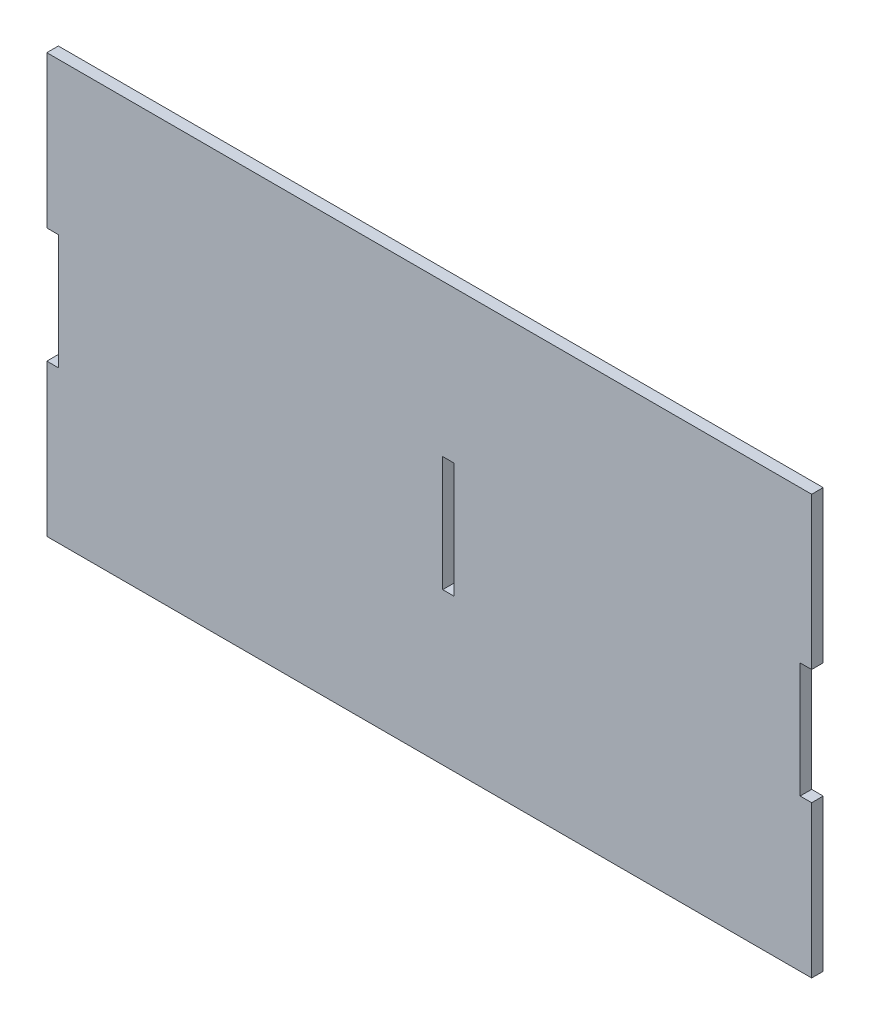
ISO-10303-21;
HEADER;
FILE_DESCRIPTION(('STEP AP214'),'2;1');
FILE_NAME('part.step','',(''),(''),'','','');
FILE_SCHEMA(('AUTOMOTIVE_DESIGN { 1 0 10303 214 1 1 1 1 }'));
ENDSEC;
DATA;
#1=APPLICATION_CONTEXT('core data for automotive mechanical design processes');
#2=APPLICATION_PROTOCOL_DEFINITION('international standard','automotive_design',2000,#1);
#3=PRODUCT_CONTEXT('',#1,'mechanical');
#4=PRODUCT('Part','Part','',(#3));
#5=PRODUCT_RELATED_PRODUCT_CATEGORY('part','',(#4));
#6=PRODUCT_DEFINITION_FORMATION('','',#4);
#7=PRODUCT_DEFINITION_CONTEXT('part definition',#1,'design');
#8=PRODUCT_DEFINITION('design','',#6,#7);
#9=PRODUCT_DEFINITION_SHAPE('','',#8);
#10=(LENGTH_UNIT() NAMED_UNIT(*) SI_UNIT(.MILLI.,.METRE.));
#11=(NAMED_UNIT(*) PLANE_ANGLE_UNIT() SI_UNIT($,.RADIAN.));
#12=(NAMED_UNIT(*) SI_UNIT($,.STERADIAN.) SOLID_ANGLE_UNIT());
#13=UNCERTAINTY_MEASURE_WITH_UNIT(LENGTH_MEASURE(1.E-05),#10,'distance_accuracy_value','');
#14=(GEOMETRIC_REPRESENTATION_CONTEXT(3) GLOBAL_UNCERTAINTY_ASSIGNED_CONTEXT((#13)) GLOBAL_UNIT_ASSIGNED_CONTEXT((#10,
#11,#12)) REPRESENTATION_CONTEXT('',''));
#15=CARTESIAN_POINT('',(0.,0.,0.));
#16=DIRECTION('',(0.,0.,1.));
#17=DIRECTION('',(1.,0.,0.));
#18=AXIS2_PLACEMENT_3D('',#15,#16,#17);
#19=CARTESIAN_POINT('',(0.,0.,3.));
#20=DIRECTION('',(0.,0.,-1.));
#21=DIRECTION('',(-1.,0.,0.));
#22=AXIS2_PLACEMENT_3D('',#19,#20,#21);
#23=PLANE('',#22);
#24=DIRECTION('',(0.,-1.,0.));
#25=VECTOR('',#24,1.);
#26=CARTESIAN_POINT('',(659.,69.5,3.));
#27=LINE('',#26,#25);
#28=CARTESIAN_POINT('',(659.,109.,3.));
#29=VERTEX_POINT('',#28);
#30=CARTESIAN_POINT('',(659.,69.5,3.));
#31=VERTEX_POINT('',#30);
#32=EDGE_CURVE('E186',#29,#31,#27,.T.);
#33=ORIENTED_EDGE('',*,*,#32,.T.);
#34=DIRECTION('',(1.,0.,0.));
#35=VECTOR('',#34,1.);
#36=CARTESIAN_POINT('',(659.,69.5,3.));
#37=LINE('',#36,#35);
#38=CARTESIAN_POINT('',(662.,69.5,3.));
#39=VERTEX_POINT('',#38);
#40=EDGE_CURVE('E189',#31,#39,#37,.T.);
#41=ORIENTED_EDGE('',*,*,#40,.T.);
#42=DIRECTION('',(0.,-1.,0.));
#43=VECTOR('',#42,1.);
#44=CARTESIAN_POINT('',(662.,69.5,3.));
#45=LINE('',#44,#43);
#46=CARTESIAN_POINT('',(662.,39.5,3.));
#47=VERTEX_POINT('',#46);
#48=EDGE_CURVE('E192',#39,#47,#45,.T.);
#49=ORIENTED_EDGE('',*,*,#48,.T.);
#50=DIRECTION('',(-1.,0.,0.));
#51=VECTOR('',#50,1.);
#52=CARTESIAN_POINT('',(659.,39.5,3.));
#53=LINE('',#52,#51);
#54=CARTESIAN_POINT('',(659.,39.5,3.));
#55=VERTEX_POINT('',#54);
#56=EDGE_CURVE('E194',#47,#55,#53,.T.);
#57=ORIENTED_EDGE('',*,*,#56,.T.);
#58=DIRECTION('',(0.,-1.,0.));
#59=VECTOR('',#58,1.);
#60=CARTESIAN_POINT('',(659.,39.5,3.));
#61=LINE('',#60,#59);
#62=CARTESIAN_POINT('',(659.,0.,3.));
#63=VERTEX_POINT('',#62);
#64=EDGE_CURVE('E196',#55,#63,#61,.T.);
#65=ORIENTED_EDGE('',*,*,#64,.T.);
#66=DIRECTION('',(1.,0.,0.));
#67=VECTOR('',#66,1.);
#68=CARTESIAN_POINT('',(858.,0.,3.));
#69=LINE('',#68,#67);
#70=CARTESIAN_POINT('',(858.,0.,3.));
#71=VERTEX_POINT('',#70);
#72=EDGE_CURVE('E198',#63,#71,#69,.T.);
#73=ORIENTED_EDGE('',*,*,#72,.T.);
#74=DIRECTION('',(0.,1.,0.));
#75=VECTOR('',#74,1.);
#76=CARTESIAN_POINT('',(858.,39.5,3.));
#77=LINE('',#76,#75);
#78=CARTESIAN_POINT('',(858.,39.5,3.));
#79=VERTEX_POINT('',#78);
#80=EDGE_CURVE('E200',#71,#79,#77,.T.);
#81=ORIENTED_EDGE('',*,*,#80,.T.);
#82=DIRECTION('',(-1.,0.,0.));
#83=VECTOR('',#82,1.);
#84=CARTESIAN_POINT('',(855.,39.5000000000001,3.));
#85=LINE('',#84,#83);
#86=CARTESIAN_POINT('',(855.,39.5000000000001,3.));
#87=VERTEX_POINT('',#86);
#88=EDGE_CURVE('E202',#79,#87,#85,.T.);
#89=ORIENTED_EDGE('',*,*,#88,.T.);
#90=DIRECTION('',(0.,1.,0.));
#91=VECTOR('',#90,1.);
#92=CARTESIAN_POINT('',(855.,69.5000000000001,3.));
#93=LINE('',#92,#91);
#94=CARTESIAN_POINT('',(855.,69.5000000000001,3.));
#95=VERTEX_POINT('',#94);
#96=EDGE_CURVE('E204',#87,#95,#93,.T.);
#97=ORIENTED_EDGE('',*,*,#96,.T.);
#98=DIRECTION('',(1.,0.,0.));
#99=VECTOR('',#98,1.);
#100=CARTESIAN_POINT('',(855.,69.5000000000001,3.));
#101=LINE('',#100,#99);
#102=CARTESIAN_POINT('',(858.,69.5000000000001,3.));
#103=VERTEX_POINT('',#102);
#104=EDGE_CURVE('E206',#95,#103,#101,.T.);
#105=ORIENTED_EDGE('',*,*,#104,.T.);
#106=DIRECTION('',(0.,1.,0.));
#107=VECTOR('',#106,1.);
#108=CARTESIAN_POINT('',(858.,69.5000000000001,3.));
#109=LINE('',#108,#107);
#110=CARTESIAN_POINT('',(858.,109.,3.));
#111=VERTEX_POINT('',#110);
#112=EDGE_CURVE('E208',#103,#111,#109,.T.);
#113=ORIENTED_EDGE('',*,*,#112,.T.);
#114=DIRECTION('',(-1.,0.,0.));
#115=VECTOR('',#114,1.);
#116=CARTESIAN_POINT('',(659.,109.,3.));
#117=LINE('',#116,#115);
#118=EDGE_CURVE('E210',#111,#29,#117,.T.);
#119=ORIENTED_EDGE('',*,*,#118,.T.);
#120=EDGE_LOOP('',(#33,#41,#49,#57,#65,#73,#81,#89,#97,#105,#113,#119));
#121=FACE_BOUND('',#120,.T.);
#122=DIRECTION('',(0.,-1.,0.));
#123=VECTOR('',#122,1.);
#124=CARTESIAN_POINT('',(762.,69.5,3.));
#125=LINE('',#124,#123);
#126=CARTESIAN_POINT('',(762.,69.5,3.));
#127=VERTEX_POINT('',#126);
#128=CARTESIAN_POINT('',(762.,39.5,3.));
#129=VERTEX_POINT('',#128);
#130=EDGE_CURVE('E150',#127,#129,#125,.T.);
#131=ORIENTED_EDGE('',*,*,#130,.F.);
#132=DIRECTION('',(-1.,0.,0.));
#133=VECTOR('',#132,1.);
#134=CARTESIAN_POINT('',(762.,69.5,3.));
#135=LINE('',#134,#133);
#136=CARTESIAN_POINT('',(765.,69.5,3.));
#137=VERTEX_POINT('',#136);
#138=EDGE_CURVE('E172',#137,#127,#135,.T.);
#139=ORIENTED_EDGE('',*,*,#138,.F.);
#140=DIRECTION('',(0.,1.,0.));
#141=VECTOR('',#140,1.);
#142=CARTESIAN_POINT('',(765.,69.5,3.));
#143=LINE('',#142,#141);
#144=CARTESIAN_POINT('',(765.,39.5000000000001,3.));
#145=VERTEX_POINT('',#144);
#146=EDGE_CURVE('E170',#145,#137,#143,.T.);
#147=ORIENTED_EDGE('',*,*,#146,.F.);
#148=DIRECTION('',(1.,0.,0.));
#149=VECTOR('',#148,1.);
#150=CARTESIAN_POINT('',(762.,39.5,3.));
#151=LINE('',#150,#149);
#152=EDGE_CURVE('E158',#129,#145,#151,.T.);
#153=ORIENTED_EDGE('',*,*,#152,.F.);
#154=EDGE_LOOP('',(#131,#139,#147,#153));
#155=FACE_BOUND('',#154,.T.);
#156=ADVANCED_FACE('F37',(#121,#155),#23,.F.);
#157=CARTESIAN_POINT('',(0.,0.,0.));
#158=DIRECTION('',(0.,0.,-1.));
#159=DIRECTION('',(-1.,0.,0.));
#160=AXIS2_PLACEMENT_3D('',#157,#158,#159);
#161=PLANE('',#160);
#162=DIRECTION('',(0.,-1.,0.));
#163=VECTOR('',#162,1.);
#164=CARTESIAN_POINT('',(659.,69.5,0.));
#165=LINE('',#164,#163);
#166=CARTESIAN_POINT('',(659.,109.,0.));
#167=VERTEX_POINT('',#166);
#168=CARTESIAN_POINT('',(659.,69.5,0.));
#169=VERTEX_POINT('',#168);
#170=EDGE_CURVE('E166',#167,#169,#165,.T.);
#171=ORIENTED_EDGE('',*,*,#170,.F.);
#172=DIRECTION('',(-1.,0.,0.));
#173=VECTOR('',#172,1.);
#174=CARTESIAN_POINT('',(659.,109.,0.));
#175=LINE('',#174,#173);
#176=CARTESIAN_POINT('',(858.,109.,0.));
#177=VERTEX_POINT('',#176);
#178=EDGE_CURVE('E190',#177,#167,#175,.T.);
#179=ORIENTED_EDGE('',*,*,#178,.F.);
#180=DIRECTION('',(0.,1.,0.));
#181=VECTOR('',#180,1.);
#182=CARTESIAN_POINT('',(858.,69.5000000000001,0.));
#183=LINE('',#182,#181);
#184=CARTESIAN_POINT('',(858.,69.5000000000001,0.));
#185=VERTEX_POINT('',#184);
#186=EDGE_CURVE('E233',#185,#177,#183,.T.);
#187=ORIENTED_EDGE('',*,*,#186,.F.);
#188=DIRECTION('',(1.,0.,0.));
#189=VECTOR('',#188,1.);
#190=CARTESIAN_POINT('',(855.,69.5000000000001,0.));
#191=LINE('',#190,#189);
#192=CARTESIAN_POINT('',(855.,69.5000000000001,0.));
#193=VERTEX_POINT('',#192);
#194=EDGE_CURVE('E231',#193,#185,#191,.T.);
#195=ORIENTED_EDGE('',*,*,#194,.F.);
#196=DIRECTION('',(0.,1.,0.));
#197=VECTOR('',#196,1.);
#198=CARTESIAN_POINT('',(855.,69.5000000000001,0.));
#199=LINE('',#198,#197);
#200=CARTESIAN_POINT('',(855.,39.5000000000001,0.));
#201=VERTEX_POINT('',#200);
#202=EDGE_CURVE('E229',#201,#193,#199,.T.);
#203=ORIENTED_EDGE('',*,*,#202,.F.);
#204=DIRECTION('',(-1.,0.,0.));
#205=VECTOR('',#204,1.);
#206=CARTESIAN_POINT('',(855.,39.5000000000001,0.));
#207=LINE('',#206,#205);
#208=CARTESIAN_POINT('',(858.,39.5,0.));
#209=VERTEX_POINT('',#208);
#210=EDGE_CURVE('E227',#209,#201,#207,.T.);
#211=ORIENTED_EDGE('',*,*,#210,.F.);
#212=DIRECTION('',(0.,1.,0.));
#213=VECTOR('',#212,1.);
#214=CARTESIAN_POINT('',(858.,39.5,0.));
#215=LINE('',#214,#213);
#216=CARTESIAN_POINT('',(858.,0.,0.));
#217=VERTEX_POINT('',#216);
#218=EDGE_CURVE('E225',#217,#209,#215,.T.);
#219=ORIENTED_EDGE('',*,*,#218,.F.);
#220=DIRECTION('',(1.,0.,0.));
#221=VECTOR('',#220,1.);
#222=CARTESIAN_POINT('',(858.,0.,0.));
#223=LINE('',#222,#221);
#224=CARTESIAN_POINT('',(659.,0.,0.));
#225=VERTEX_POINT('',#224);
#226=EDGE_CURVE('E223',#225,#217,#223,.T.);
#227=ORIENTED_EDGE('',*,*,#226,.F.);
#228=DIRECTION('',(0.,-1.,0.));
#229=VECTOR('',#228,1.);
#230=CARTESIAN_POINT('',(659.,39.5,0.));
#231=LINE('',#230,#229);
#232=CARTESIAN_POINT('',(659.,39.5,0.));
#233=VERTEX_POINT('',#232);
#234=EDGE_CURVE('E221',#233,#225,#231,.T.);
#235=ORIENTED_EDGE('',*,*,#234,.F.);
#236=DIRECTION('',(-1.,0.,0.));
#237=VECTOR('',#236,1.);
#238=CARTESIAN_POINT('',(659.,39.5,0.));
#239=LINE('',#238,#237);
#240=CARTESIAN_POINT('',(662.,39.5,0.));
#241=VERTEX_POINT('',#240);
#242=EDGE_CURVE('E219',#241,#233,#239,.T.);
#243=ORIENTED_EDGE('',*,*,#242,.F.);
#244=DIRECTION('',(0.,-1.,0.));
#245=VECTOR('',#244,1.);
#246=CARTESIAN_POINT('',(662.,69.5,0.));
#247=LINE('',#246,#245);
#248=CARTESIAN_POINT('',(662.,69.5,0.));
#249=VERTEX_POINT('',#248);
#250=EDGE_CURVE('E217',#249,#241,#247,.T.);
#251=ORIENTED_EDGE('',*,*,#250,.F.);
#252=DIRECTION('',(1.,0.,0.));
#253=VECTOR('',#252,1.);
#254=CARTESIAN_POINT('',(659.,69.5,0.));
#255=LINE('',#254,#253);
#256=EDGE_CURVE('E215',#169,#249,#255,.T.);
#257=ORIENTED_EDGE('',*,*,#256,.F.);
#258=EDGE_LOOP('',(#171,#179,#187,#195,#203,#211,#219,#227,#235,#243,#251,#257));
#259=FACE_BOUND('',#258,.T.);
#260=DIRECTION('',(-1.,0.,0.));
#261=VECTOR('',#260,1.);
#262=CARTESIAN_POINT('',(762.,69.5,0.));
#263=LINE('',#262,#261);
#264=CARTESIAN_POINT('',(765.,69.5,0.));
#265=VERTEX_POINT('',#264);
#266=CARTESIAN_POINT('',(762.,69.5,0.));
#267=VERTEX_POINT('',#266);
#268=EDGE_CURVE('E159',#265,#267,#263,.T.);
#269=ORIENTED_EDGE('',*,*,#268,.T.);
#270=DIRECTION('',(0.,-1.,0.));
#271=VECTOR('',#270,1.);
#272=CARTESIAN_POINT('',(762.,69.5,0.));
#273=LINE('',#272,#271);
#274=CARTESIAN_POINT('',(762.,39.5,0.));
#275=VERTEX_POINT('',#274);
#276=EDGE_CURVE('E60',#267,#275,#273,.T.);
#277=ORIENTED_EDGE('',*,*,#276,.T.);
#278=DIRECTION('',(1.,0.,0.));
#279=VECTOR('',#278,1.);
#280=CARTESIAN_POINT('',(762.,39.5,0.));
#281=LINE('',#280,#279);
#282=CARTESIAN_POINT('',(765.,39.5000000000001,0.));
#283=VERTEX_POINT('',#282);
#284=EDGE_CURVE('E165',#275,#283,#281,.T.);
#285=ORIENTED_EDGE('',*,*,#284,.T.);
#286=DIRECTION('',(0.,1.,0.));
#287=VECTOR('',#286,1.);
#288=CARTESIAN_POINT('',(765.,69.5,0.));
#289=LINE('',#288,#287);
#290=EDGE_CURVE('E178',#283,#265,#289,.T.);
#291=ORIENTED_EDGE('',*,*,#290,.T.);
#292=EDGE_LOOP('',(#269,#277,#285,#291));
#293=FACE_BOUND('',#292,.T.);
#294=ADVANCED_FACE('F275',(#259,#293),#161,.T.);
#295=CARTESIAN_POINT('',(659.,69.5,3.));
#296=DIRECTION('',(1.,0.,0.));
#297=DIRECTION('',(0.,0.,-1.));
#298=AXIS2_PLACEMENT_3D('',#295,#296,#297);
#299=PLANE('',#298);
#300=ORIENTED_EDGE('',*,*,#170,.T.);
#301=DIRECTION('',(0.,0.,-1.));
#302=VECTOR('',#301,1.);
#303=CARTESIAN_POINT('',(659.,69.5,3.));
#304=LINE('',#303,#302);
#305=EDGE_CURVE('E11',#31,#169,#304,.T.);
#306=ORIENTED_EDGE('',*,*,#305,.F.);
#307=ORIENTED_EDGE('',*,*,#32,.F.);
#308=DIRECTION('',(0.,0.,-1.));
#309=VECTOR('',#308,1.);
#310=CARTESIAN_POINT('',(659.,109.,3.));
#311=LINE('',#310,#309);
#312=EDGE_CURVE('E212',#29,#167,#311,.T.);
#313=ORIENTED_EDGE('',*,*,#312,.T.);
#314=EDGE_LOOP('',(#300,#306,#307,#313));
#315=FACE_BOUND('',#314,.T.);
#316=ADVANCED_FACE('F39',(#315),#299,.F.);
#317=CARTESIAN_POINT('',(659.,69.5,3.));
#318=DIRECTION('',(0.,1.,0.));
#319=DIRECTION('',(0.,0.,1.));
#320=AXIS2_PLACEMENT_3D('',#317,#318,#319);
#321=PLANE('',#320);
#322=ORIENTED_EDGE('',*,*,#256,.T.);
#323=DIRECTION('',(0.,0.,-1.));
#324=VECTOR('',#323,1.);
#325=CARTESIAN_POINT('',(662.,69.5,3.));
#326=LINE('',#325,#324);
#327=EDGE_CURVE('E45',#39,#249,#326,.T.);
#328=ORIENTED_EDGE('',*,*,#327,.F.);
#329=ORIENTED_EDGE('',*,*,#40,.F.);
#330=ORIENTED_EDGE('',*,*,#305,.T.);
#331=EDGE_LOOP('',(#322,#328,#329,#330));
#332=FACE_BOUND('',#331,.T.);
#333=ADVANCED_FACE('F292',(#332),#321,.F.);
#334=CARTESIAN_POINT('',(662.,69.5,3.));
#335=DIRECTION('',(1.,0.,0.));
#336=DIRECTION('',(0.,0.,-1.));
#337=AXIS2_PLACEMENT_3D('',#334,#335,#336);
#338=PLANE('',#337);
#339=ORIENTED_EDGE('',*,*,#250,.T.);
#340=DIRECTION('',(0.,0.,-1.));
#341=VECTOR('',#340,1.);
#342=CARTESIAN_POINT('',(662.,39.5,3.));
#343=LINE('',#342,#341);
#344=EDGE_CURVE('E262',#47,#241,#343,.T.);
#345=ORIENTED_EDGE('',*,*,#344,.F.);
#346=ORIENTED_EDGE('',*,*,#48,.F.);
#347=ORIENTED_EDGE('',*,*,#327,.T.);
#348=EDGE_LOOP('',(#339,#345,#346,#347));
#349=FACE_BOUND('',#348,.T.);
#350=ADVANCED_FACE('F269',(#349),#338,.F.);
#351=CARTESIAN_POINT('',(659.,39.5,3.));
#352=DIRECTION('',(0.,-1.,0.));
#353=DIRECTION('',(0.,0.,-1.));
#354=AXIS2_PLACEMENT_3D('',#351,#352,#353);
#355=PLANE('',#354);
#356=ORIENTED_EDGE('',*,*,#242,.T.);
#357=DIRECTION('',(0.,0.,-1.));
#358=VECTOR('',#357,1.);
#359=CARTESIAN_POINT('',(659.,39.5,3.));
#360=LINE('',#359,#358);
#361=EDGE_CURVE('E259',#55,#233,#360,.T.);
#362=ORIENTED_EDGE('',*,*,#361,.F.);
#363=ORIENTED_EDGE('',*,*,#56,.F.);
#364=ORIENTED_EDGE('',*,*,#344,.T.);
#365=EDGE_LOOP('',(#356,#362,#363,#364));
#366=FACE_BOUND('',#365,.T.);
#367=ADVANCED_FACE('F281',(#366),#355,.F.);
#368=CARTESIAN_POINT('',(659.,39.5,3.));
#369=DIRECTION('',(1.,0.,0.));
#370=DIRECTION('',(0.,0.,-1.));
#371=AXIS2_PLACEMENT_3D('',#368,#369,#370);
#372=PLANE('',#371);
#373=ORIENTED_EDGE('',*,*,#234,.T.);
#374=DIRECTION('',(0.,0.,-1.));
#375=VECTOR('',#374,1.);
#376=CARTESIAN_POINT('',(659.,0.,3.));
#377=LINE('',#376,#375);
#378=EDGE_CURVE('E256',#63,#225,#377,.T.);
#379=ORIENTED_EDGE('',*,*,#378,.F.);
#380=ORIENTED_EDGE('',*,*,#64,.F.);
#381=ORIENTED_EDGE('',*,*,#361,.T.);
#382=EDGE_LOOP('',(#373,#379,#380,#381));
#383=FACE_BOUND('',#382,.T.);
#384=ADVANCED_FACE('F285',(#383),#372,.F.);
#385=CARTESIAN_POINT('',(858.,0.,3.));
#386=DIRECTION('',(0.,1.,0.));
#387=DIRECTION('',(-1.,0.,0.));
#388=AXIS2_PLACEMENT_3D('',#385,#386,#387);
#389=PLANE('',#388);
#390=ORIENTED_EDGE('',*,*,#226,.T.);
#391=DIRECTION('',(0.,0.,-1.));
#392=VECTOR('',#391,1.);
#393=CARTESIAN_POINT('',(858.,0.,3.));
#394=LINE('',#393,#392);
#395=EDGE_CURVE('E253',#71,#217,#394,.T.);
#396=ORIENTED_EDGE('',*,*,#395,.F.);
#397=ORIENTED_EDGE('',*,*,#72,.F.);
#398=ORIENTED_EDGE('',*,*,#378,.T.);
#399=EDGE_LOOP('',(#390,#396,#397,#398));
#400=FACE_BOUND('',#399,.T.);
#401=ADVANCED_FACE('F325',(#400),#389,.F.);
#402=CARTESIAN_POINT('',(858.,39.5,3.));
#403=DIRECTION('',(-1.,0.,0.));
#404=DIRECTION('',(0.,0.,1.));
#405=AXIS2_PLACEMENT_3D('',#402,#403,#404);
#406=PLANE('',#405);
#407=ORIENTED_EDGE('',*,*,#218,.T.);
#408=DIRECTION('',(0.,0.,-1.));
#409=VECTOR('',#408,1.);
#410=CARTESIAN_POINT('',(858.,39.5,3.));
#411=LINE('',#410,#409);
#412=EDGE_CURVE('E250',#79,#209,#411,.T.);
#413=ORIENTED_EDGE('',*,*,#412,.F.);
#414=ORIENTED_EDGE('',*,*,#80,.F.);
#415=ORIENTED_EDGE('',*,*,#395,.T.);
#416=EDGE_LOOP('',(#407,#413,#414,#415));
#417=FACE_BOUND('',#416,.T.);
#418=ADVANCED_FACE('F323',(#417),#406,.F.);
#419=CARTESIAN_POINT('',(855.,39.5000000000001,3.));
#420=DIRECTION('',(0.,-1.,0.));
#421=DIRECTION('',(1.,0.,0.));
#422=AXIS2_PLACEMENT_3D('',#419,#420,#421);
#423=PLANE('',#422);
#424=ORIENTED_EDGE('',*,*,#210,.T.);
#425=DIRECTION('',(0.,0.,-1.));
#426=VECTOR('',#425,1.);
#427=CARTESIAN_POINT('',(855.,39.5000000000001,3.));
#428=LINE('',#427,#426);
#429=EDGE_CURVE('E247',#87,#201,#428,.T.);
#430=ORIENTED_EDGE('',*,*,#429,.F.);
#431=ORIENTED_EDGE('',*,*,#88,.F.);
#432=ORIENTED_EDGE('',*,*,#412,.T.);
#433=EDGE_LOOP('',(#424,#430,#431,#432));
#434=FACE_BOUND('',#433,.T.);
#435=ADVANCED_FACE('F319',(#434),#423,.F.);
#436=CARTESIAN_POINT('',(855.,69.5000000000001,3.));
#437=DIRECTION('',(-1.,0.,0.));
#438=DIRECTION('',(0.,0.,1.));
#439=AXIS2_PLACEMENT_3D('',#436,#437,#438);
#440=PLANE('',#439);
#441=ORIENTED_EDGE('',*,*,#202,.T.);
#442=DIRECTION('',(0.,0.,-1.));
#443=VECTOR('',#442,1.);
#444=CARTESIAN_POINT('',(855.,69.5000000000001,3.));
#445=LINE('',#444,#443);
#446=EDGE_CURVE('E244',#95,#193,#445,.T.);
#447=ORIENTED_EDGE('',*,*,#446,.F.);
#448=ORIENTED_EDGE('',*,*,#96,.F.);
#449=ORIENTED_EDGE('',*,*,#429,.T.);
#450=EDGE_LOOP('',(#441,#447,#448,#449));
#451=FACE_BOUND('',#450,.T.);
#452=ADVANCED_FACE('F314',(#451),#440,.F.);
#453=CARTESIAN_POINT('',(855.,69.5000000000001,3.));
#454=DIRECTION('',(0.,1.,0.));
#455=DIRECTION('',(0.,0.,1.));
#456=AXIS2_PLACEMENT_3D('',#453,#454,#455);
#457=PLANE('',#456);
#458=ORIENTED_EDGE('',*,*,#194,.T.);
#459=DIRECTION('',(0.,0.,-1.));
#460=VECTOR('',#459,1.);
#461=CARTESIAN_POINT('',(858.,69.5000000000001,3.));
#462=LINE('',#461,#460);
#463=EDGE_CURVE('E241',#103,#185,#462,.T.);
#464=ORIENTED_EDGE('',*,*,#463,.F.);
#465=ORIENTED_EDGE('',*,*,#104,.F.);
#466=ORIENTED_EDGE('',*,*,#446,.T.);
#467=EDGE_LOOP('',(#458,#464,#465,#466));
#468=FACE_BOUND('',#467,.T.);
#469=ADVANCED_FACE('F308',(#468),#457,.F.);
#470=CARTESIAN_POINT('',(858.,69.5000000000001,3.));
#471=DIRECTION('',(-1.,0.,0.));
#472=DIRECTION('',(0.,0.,1.));
#473=AXIS2_PLACEMENT_3D('',#470,#471,#472);
#474=PLANE('',#473);
#475=ORIENTED_EDGE('',*,*,#186,.T.);
#476=DIRECTION('',(0.,0.,-1.));
#477=VECTOR('',#476,1.);
#478=CARTESIAN_POINT('',(858.,109.,3.));
#479=LINE('',#478,#477);
#480=EDGE_CURVE('E238',#111,#177,#479,.T.);
#481=ORIENTED_EDGE('',*,*,#480,.F.);
#482=ORIENTED_EDGE('',*,*,#112,.F.);
#483=ORIENTED_EDGE('',*,*,#463,.T.);
#484=EDGE_LOOP('',(#475,#481,#482,#483));
#485=FACE_BOUND('',#484,.T.);
#486=ADVANCED_FACE('F304',(#485),#474,.F.);
#487=CARTESIAN_POINT('',(659.,109.,3.));
#488=DIRECTION('',(0.,-1.,0.));
#489=DIRECTION('',(0.,0.,-1.));
#490=AXIS2_PLACEMENT_3D('',#487,#488,#489);
#491=PLANE('',#490);
#492=ORIENTED_EDGE('',*,*,#178,.T.);
#493=ORIENTED_EDGE('',*,*,#312,.F.);
#494=ORIENTED_EDGE('',*,*,#118,.F.);
#495=ORIENTED_EDGE('',*,*,#480,.T.);
#496=EDGE_LOOP('',(#492,#493,#494,#495));
#497=FACE_BOUND('',#496,.T.);
#498=ADVANCED_FACE('F299',(#497),#491,.F.);
#499=CARTESIAN_POINT('',(762.,69.5,3.));
#500=DIRECTION('',(1.,0.,0.));
#501=DIRECTION('',(0.,0.,-1.));
#502=AXIS2_PLACEMENT_3D('',#499,#500,#501);
#503=PLANE('',#502);
#504=ORIENTED_EDGE('',*,*,#276,.F.);
#505=DIRECTION('',(0.,0.,-1.));
#506=VECTOR('',#505,1.);
#507=CARTESIAN_POINT('',(762.,69.5,3.));
#508=LINE('',#507,#506);
#509=EDGE_CURVE('E154',#127,#267,#508,.T.);
#510=ORIENTED_EDGE('',*,*,#509,.F.);
#511=ORIENTED_EDGE('',*,*,#130,.T.);
#512=DIRECTION('',(0.,0.,-1.));
#513=VECTOR('',#512,1.);
#514=CARTESIAN_POINT('',(762.,39.5,3.));
#515=LINE('',#514,#513);
#516=EDGE_CURVE('E153',#129,#275,#515,.T.);
#517=ORIENTED_EDGE('',*,*,#516,.T.);
#518=EDGE_LOOP('',(#504,#510,#511,#517));
#519=FACE_BOUND('',#518,.T.);
#520=ADVANCED_FACE('F152',(#519),#503,.T.);
#521=CARTESIAN_POINT('',(762.,39.5,3.));
#522=DIRECTION('',(0.,1.,0.));
#523=DIRECTION('',(-1.,0.,0.));
#524=AXIS2_PLACEMENT_3D('',#521,#522,#523);
#525=PLANE('',#524);
#526=ORIENTED_EDGE('',*,*,#284,.F.);
#527=ORIENTED_EDGE('',*,*,#516,.F.);
#528=ORIENTED_EDGE('',*,*,#152,.T.);
#529=DIRECTION('',(0.,0.,-1.));
#530=VECTOR('',#529,1.);
#531=CARTESIAN_POINT('',(765.,39.5000000000001,3.));
#532=LINE('',#531,#530);
#533=EDGE_CURVE('E167',#145,#283,#532,.T.);
#534=ORIENTED_EDGE('',*,*,#533,.T.);
#535=EDGE_LOOP('',(#526,#527,#528,#534));
#536=FACE_BOUND('',#535,.T.);
#537=ADVANCED_FACE('F162',(#536),#525,.T.);
#538=CARTESIAN_POINT('',(765.,69.5,3.));
#539=DIRECTION('',(-1.,0.,0.));
#540=DIRECTION('',(0.,0.,1.));
#541=AXIS2_PLACEMENT_3D('',#538,#539,#540);
#542=PLANE('',#541);
#543=ORIENTED_EDGE('',*,*,#290,.F.);
#544=ORIENTED_EDGE('',*,*,#533,.F.);
#545=ORIENTED_EDGE('',*,*,#146,.T.);
#546=DIRECTION('',(0.,0.,-1.));
#547=VECTOR('',#546,1.);
#548=CARTESIAN_POINT('',(765.,69.5,3.));
#549=LINE('',#548,#547);
#550=EDGE_CURVE('E52',#137,#265,#549,.T.);
#551=ORIENTED_EDGE('',*,*,#550,.T.);
#552=EDGE_LOOP('',(#543,#544,#545,#551));
#553=FACE_BOUND('',#552,.T.);
#554=ADVANCED_FACE('F383',(#553),#542,.T.);
#555=CARTESIAN_POINT('',(762.,69.5,3.));
#556=DIRECTION('',(0.,-1.,0.));
#557=DIRECTION('',(1.,0.,0.));
#558=AXIS2_PLACEMENT_3D('',#555,#556,#557);
#559=PLANE('',#558);
#560=ORIENTED_EDGE('',*,*,#268,.F.);
#561=ORIENTED_EDGE('',*,*,#550,.F.);
#562=ORIENTED_EDGE('',*,*,#138,.T.);
#563=ORIENTED_EDGE('',*,*,#509,.T.);
#564=EDGE_LOOP('',(#560,#561,#562,#563));
#565=FACE_BOUND('',#564,.T.);
#566=ADVANCED_FACE('F389',(#565),#559,.T.);
#567=CLOSED_SHELL('',(#156,#294,#316,#333,#350,#367,#384,#401,#418,#435,#452,#469,#486,#498,
#520,#537,#554,#566));
#568=MANIFOLD_SOLID_BREP('B2',#567);
#569=ADVANCED_BREP_SHAPE_REPRESENTATION('',(#18,#568),#14);
#570=SHAPE_DEFINITION_REPRESENTATION(#9,#569);
ENDSEC;
END-ISO-10303-21;
